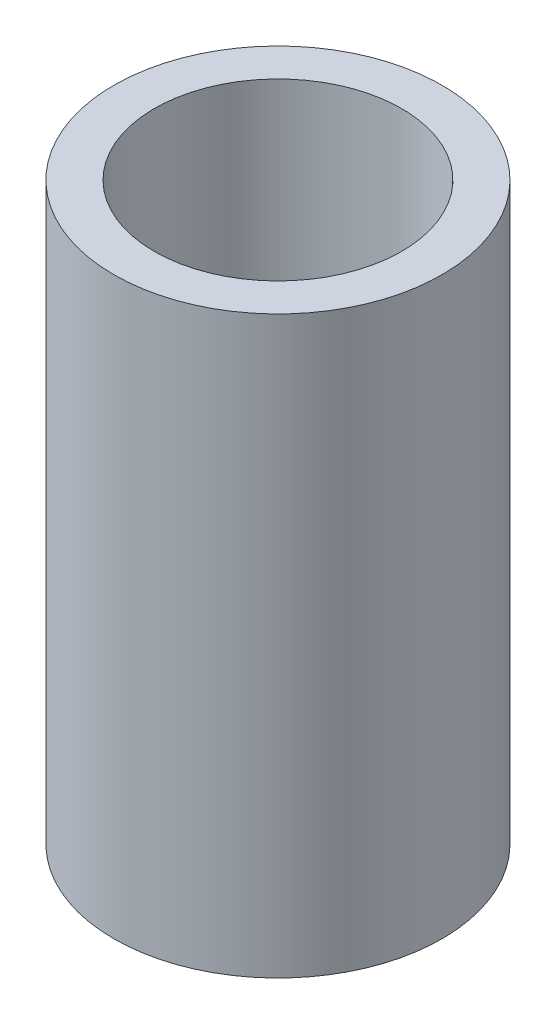
ISO-10303-21;
HEADER;
FILE_DESCRIPTION(('STEP AP214'),'2;1');
FILE_NAME('part.step','',(''),(''),'','','');
FILE_SCHEMA(('AUTOMOTIVE_DESIGN { 1 0 10303 214 1 1 1 1 }'));
ENDSEC;
DATA;
#1=APPLICATION_CONTEXT('core data for automotive mechanical design processes');
#2=APPLICATION_PROTOCOL_DEFINITION('international standard','automotive_design',2000,#1);
#3=PRODUCT_CONTEXT('',#1,'mechanical');
#4=PRODUCT('Part','Part','',(#3));
#5=PRODUCT_RELATED_PRODUCT_CATEGORY('part','',(#4));
#6=PRODUCT_DEFINITION_FORMATION('','',#4);
#7=PRODUCT_DEFINITION_CONTEXT('part definition',#1,'design');
#8=PRODUCT_DEFINITION('design','',#6,#7);
#9=PRODUCT_DEFINITION_SHAPE('','',#8);
#10=(LENGTH_UNIT() NAMED_UNIT(*) SI_UNIT(.MILLI.,.METRE.));
#11=(NAMED_UNIT(*) PLANE_ANGLE_UNIT() SI_UNIT($,.RADIAN.));
#12=(NAMED_UNIT(*) SI_UNIT($,.STERADIAN.) SOLID_ANGLE_UNIT());
#13=UNCERTAINTY_MEASURE_WITH_UNIT(LENGTH_MEASURE(1.E-05),#10,'distance_accuracy_value','');
#14=(GEOMETRIC_REPRESENTATION_CONTEXT(3) GLOBAL_UNCERTAINTY_ASSIGNED_CONTEXT((#13)) GLOBAL_UNIT_ASSIGNED_CONTEXT((#10,
#11,#12)) REPRESENTATION_CONTEXT('',''));
#15=CARTESIAN_POINT('',(0.,0.,0.));
#16=DIRECTION('',(0.,0.,1.));
#17=DIRECTION('',(1.,0.,0.));
#18=AXIS2_PLACEMENT_3D('',#15,#16,#17);
#19=CARTESIAN_POINT('',(0.,22.25675,0.));
#20=DIRECTION('',(0.,1.,0.));
#21=DIRECTION('',(0.,0.,1.));
#22=AXIS2_PLACEMENT_3D('',#19,#20,#21);
#23=PLANE('',#22);
#24=CARTESIAN_POINT('',(0.,22.25675,0.));
#25=DIRECTION('',(0.,1.,0.));
#26=DIRECTION('',(0.,0.,1.));
#27=AXIS2_PLACEMENT_3D('',#24,#25,#26);
#28=CIRCLE('',#27,6.35);
#29=CARTESIAN_POINT('',(0.,22.25675,6.35));
#30=VERTEX_POINT('',#29);
#31=EDGE_CURVE('E10',#30,#30,#28,.T.);
#32=ORIENTED_EDGE('',*,*,#31,.T.);
#33=EDGE_LOOP('',(#32));
#34=FACE_BOUND('',#33,.T.);
#35=CARTESIAN_POINT('',(0.,22.25675,0.));
#36=DIRECTION('',(0.,1.,0.));
#37=DIRECTION('',(0.,0.,1.));
#38=AXIS2_PLACEMENT_3D('',#35,#36,#37);
#39=CIRCLE('',#38,4.7879);
#40=CARTESIAN_POINT('',(0.,22.25675,4.7879));
#41=VERTEX_POINT('',#40);
#42=EDGE_CURVE('E42',#41,#41,#39,.T.);
#43=ORIENTED_EDGE('',*,*,#42,.F.);
#44=EDGE_LOOP('',(#43));
#45=FACE_BOUND('',#44,.T.);
#46=ADVANCED_FACE('F31',(#34,#45),#23,.T.);
#47=CARTESIAN_POINT('',(0.,0.,0.));
#48=DIRECTION('',(0.,1.,0.));
#49=DIRECTION('',(0.,0.,1.));
#50=AXIS2_PLACEMENT_3D('',#47,#48,#49);
#51=PLANE('',#50);
#52=CARTESIAN_POINT('',(0.,0.,0.));
#53=DIRECTION('',(0.,1.,0.));
#54=DIRECTION('',(0.,0.,1.));
#55=AXIS2_PLACEMENT_3D('',#52,#53,#54);
#56=CIRCLE('',#55,6.35);
#57=CARTESIAN_POINT('',(0.,0.,6.35));
#58=VERTEX_POINT('',#57);
#59=EDGE_CURVE('E35',#58,#58,#56,.T.);
#60=ORIENTED_EDGE('',*,*,#59,.F.);
#61=EDGE_LOOP('',(#60));
#62=FACE_BOUND('',#61,.T.);
#63=CARTESIAN_POINT('',(0.,0.,0.));
#64=DIRECTION('',(0.,1.,0.));
#65=DIRECTION('',(0.,0.,1.));
#66=AXIS2_PLACEMENT_3D('',#63,#64,#65);
#67=CIRCLE('',#66,4.7879);
#68=CARTESIAN_POINT('',(0.,0.,4.7879));
#69=VERTEX_POINT('',#68);
#70=EDGE_CURVE('E44',#69,#69,#67,.T.);
#71=ORIENTED_EDGE('',*,*,#70,.T.);
#72=EDGE_LOOP('',(#71));
#73=FACE_BOUND('',#72,.T.);
#74=ADVANCED_FACE('F54',(#62,#73),#51,.F.);
#75=CARTESIAN_POINT('',(0.,22.25675,0.));
#76=DIRECTION('',(0.,-1.,0.));
#77=DIRECTION('',(0.,0.,-1.));
#78=AXIS2_PLACEMENT_3D('',#75,#76,#77);
#79=CYLINDRICAL_SURFACE('',#78,6.35);
#80=ORIENTED_EDGE('',*,*,#31,.F.);
#81=EDGE_LOOP('',(#80));
#82=FACE_BOUND('',#81,.T.);
#83=ORIENTED_EDGE('',*,*,#59,.T.);
#84=EDGE_LOOP('',(#83));
#85=FACE_BOUND('',#84,.T.);
#86=ADVANCED_FACE('F33',(#82,#85),#79,.T.);
#87=CARTESIAN_POINT('',(0.,22.25675,0.));
#88=DIRECTION('',(0.,-1.,0.));
#89=DIRECTION('',(0.,0.,-1.));
#90=AXIS2_PLACEMENT_3D('',#87,#88,#89);
#91=CYLINDRICAL_SURFACE('',#90,4.7879);
#92=ORIENTED_EDGE('',*,*,#42,.T.);
#93=EDGE_LOOP('',(#92));
#94=FACE_BOUND('',#93,.T.);
#95=ORIENTED_EDGE('',*,*,#70,.F.);
#96=EDGE_LOOP('',(#95));
#97=FACE_BOUND('',#96,.T.);
#98=ADVANCED_FACE('F50',(#94,#97),#91,.F.);
#99=CLOSED_SHELL('',(#46,#74,#86,#98));
#100=MANIFOLD_SOLID_BREP('B2',#99);
#101=ADVANCED_BREP_SHAPE_REPRESENTATION('',(#18,#100),#14);
#102=SHAPE_DEFINITION_REPRESENTATION(#9,#101);
ENDSEC;
END-ISO-10303-21;
